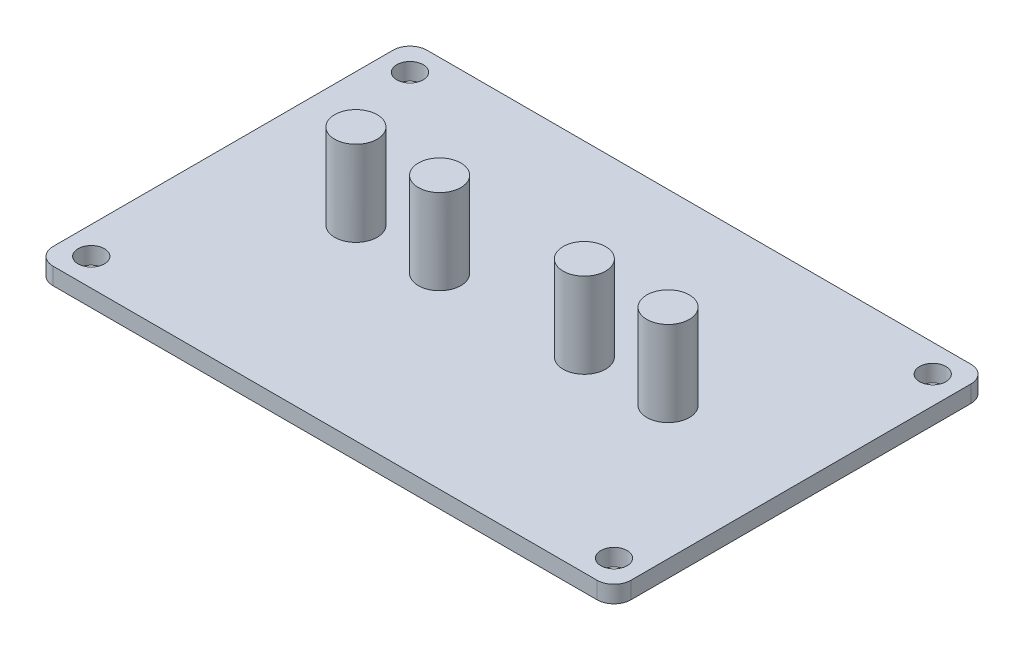
ISO-10303-21;
HEADER;
FILE_DESCRIPTION(('STEP AP214'),'2;1');
FILE_NAME('part.step','',(''),(''),'','','');
FILE_SCHEMA(('AUTOMOTIVE_DESIGN { 1 0 10303 214 1 1 1 1 }'));
ENDSEC;
DATA;
#1=APPLICATION_CONTEXT('core data for automotive mechanical design processes');
#2=APPLICATION_PROTOCOL_DEFINITION('international standard','automotive_design',2000,#1);
#3=PRODUCT_CONTEXT('',#1,'mechanical');
#4=PRODUCT('Part','Part','',(#3));
#5=PRODUCT_RELATED_PRODUCT_CATEGORY('part','',(#4));
#6=PRODUCT_DEFINITION_FORMATION('','',#4);
#7=PRODUCT_DEFINITION_CONTEXT('part definition',#1,'design');
#8=PRODUCT_DEFINITION('design','',#6,#7);
#9=PRODUCT_DEFINITION_SHAPE('','',#8);
#10=(LENGTH_UNIT() NAMED_UNIT(*) SI_UNIT(.MILLI.,.METRE.));
#11=(NAMED_UNIT(*) PLANE_ANGLE_UNIT() SI_UNIT($,.RADIAN.));
#12=(NAMED_UNIT(*) SI_UNIT($,.STERADIAN.) SOLID_ANGLE_UNIT());
#13=UNCERTAINTY_MEASURE_WITH_UNIT(LENGTH_MEASURE(1.E-05),#10,'distance_accuracy_value','');
#14=(GEOMETRIC_REPRESENTATION_CONTEXT(3) GLOBAL_UNCERTAINTY_ASSIGNED_CONTEXT((#13)) GLOBAL_UNIT_ASSIGNED_CONTEXT((#10,
#11,#12)) REPRESENTATION_CONTEXT('',''));
#15=CARTESIAN_POINT('',(0.,0.,0.));
#16=DIRECTION('',(0.,0.,1.));
#17=DIRECTION('',(1.,0.,0.));
#18=AXIS2_PLACEMENT_3D('',#15,#16,#17);
#19=CARTESIAN_POINT('',(34.,2.,22.));
#20=DIRECTION('',(-1.,0.,0.));
#21=DIRECTION('',(0.,0.,1.));
#22=AXIS2_PLACEMENT_3D('',#19,#20,#21);
#23=PLANE('',#22);
#24=DIRECTION('',(0.,0.,-1.));
#25=VECTOR('',#24,1.);
#26=CARTESIAN_POINT('',(34.,0.,22.));
#27=LINE('',#26,#25);
#28=CARTESIAN_POINT('',(34.,0.,20.));
#29=VERTEX_POINT('',#28);
#30=CARTESIAN_POINT('',(34.,0.,-20.));
#31=VERTEX_POINT('',#30);
#32=EDGE_CURVE('E129',#29,#31,#27,.T.);
#33=ORIENTED_EDGE('',*,*,#32,.T.);
#34=DIRECTION('',(0.,-1.,0.));
#35=VECTOR('',#34,1.);
#36=CARTESIAN_POINT('',(34.,2.,-20.));
#37=LINE('',#36,#35);
#38=CARTESIAN_POINT('',(34.,2.,-20.));
#39=VERTEX_POINT('',#38);
#40=EDGE_CURVE('E164',#31,#39,#37,.F.);
#41=ORIENTED_EDGE('',*,*,#40,.T.);
#42=DIRECTION('',(0.,0.,-1.));
#43=VECTOR('',#42,1.);
#44=CARTESIAN_POINT('',(34.,2.,22.));
#45=LINE('',#44,#43);
#46=CARTESIAN_POINT('',(34.,2.,20.));
#47=VERTEX_POINT('',#46);
#48=EDGE_CURVE('E127',#47,#39,#45,.T.);
#49=ORIENTED_EDGE('',*,*,#48,.F.);
#50=DIRECTION('',(0.,-1.,0.));
#51=VECTOR('',#50,1.);
#52=CARTESIAN_POINT('',(34.,2.,20.));
#53=LINE('',#52,#51);
#54=EDGE_CURVE('E161',#47,#29,#53,.T.);
#55=ORIENTED_EDGE('',*,*,#54,.T.);
#56=EDGE_LOOP('',(#33,#41,#49,#55));
#57=FACE_BOUND('',#56,.T.);
#58=ADVANCED_FACE('F34',(#57),#23,.F.);
#59=CARTESIAN_POINT('',(-34.,2.,-22.));
#60=DIRECTION('',(0.,0.,1.));
#61=DIRECTION('',(1.,0.,0.));
#62=AXIS2_PLACEMENT_3D('',#59,#60,#61);
#63=PLANE('',#62);
#64=DIRECTION('',(-1.,0.,0.));
#65=VECTOR('',#64,1.);
#66=CARTESIAN_POINT('',(-34.,0.,-22.));
#67=LINE('',#66,#65);
#68=CARTESIAN_POINT('',(32.,0.,-22.));
#69=VERTEX_POINT('',#68);
#70=CARTESIAN_POINT('',(-32.,0.,-22.));
#71=VERTEX_POINT('',#70);
#72=EDGE_CURVE('E125',#69,#71,#67,.T.);
#73=ORIENTED_EDGE('',*,*,#72,.T.);
#74=DIRECTION('',(0.,-1.,0.));
#75=VECTOR('',#74,1.);
#76=CARTESIAN_POINT('',(-32.,2.,-22.));
#77=LINE('',#76,#75);
#78=CARTESIAN_POINT('',(-32.,2.,-22.));
#79=VERTEX_POINT('',#78);
#80=EDGE_CURVE('E104',#71,#79,#77,.F.);
#81=ORIENTED_EDGE('',*,*,#80,.T.);
#82=DIRECTION('',(-1.,0.,0.));
#83=VECTOR('',#82,1.);
#84=CARTESIAN_POINT('',(-34.,2.,-22.));
#85=LINE('',#84,#83);
#86=CARTESIAN_POINT('',(32.,2.,-22.));
#87=VERTEX_POINT('',#86);
#88=EDGE_CURVE('E180',#87,#79,#85,.T.);
#89=ORIENTED_EDGE('',*,*,#88,.F.);
#90=DIRECTION('',(0.,-1.,0.));
#91=VECTOR('',#90,1.);
#92=CARTESIAN_POINT('',(32.,2.,-22.));
#93=LINE('',#92,#91);
#94=EDGE_CURVE('E109',#87,#69,#93,.T.);
#95=ORIENTED_EDGE('',*,*,#94,.T.);
#96=EDGE_LOOP('',(#73,#81,#89,#95));
#97=FACE_BOUND('',#96,.T.);
#98=ADVANCED_FACE('F255',(#97),#63,.F.);
#99=CARTESIAN_POINT('',(-34.,2.,22.));
#100=DIRECTION('',(1.,0.,0.));
#101=DIRECTION('',(0.,0.,-1.));
#102=AXIS2_PLACEMENT_3D('',#99,#100,#101);
#103=PLANE('',#102);
#104=DIRECTION('',(0.,0.,1.));
#105=VECTOR('',#104,1.);
#106=CARTESIAN_POINT('',(-34.,2.,22.));
#107=LINE('',#106,#105);
#108=CARTESIAN_POINT('',(-34.,2.,-20.));
#109=VERTEX_POINT('',#108);
#110=CARTESIAN_POINT('',(-34.,2.,20.));
#111=VERTEX_POINT('',#110);
#112=EDGE_CURVE('E118',#109,#111,#107,.T.);
#113=ORIENTED_EDGE('',*,*,#112,.F.);
#114=DIRECTION('',(0.,-1.,0.));
#115=VECTOR('',#114,1.);
#116=CARTESIAN_POINT('',(-34.,2.,-20.));
#117=LINE('',#116,#115);
#118=CARTESIAN_POINT('',(-34.,0.,-20.));
#119=VERTEX_POINT('',#118);
#120=EDGE_CURVE('E103',#109,#119,#117,.T.);
#121=ORIENTED_EDGE('',*,*,#120,.T.);
#122=DIRECTION('',(0.,0.,1.));
#123=VECTOR('',#122,1.);
#124=CARTESIAN_POINT('',(-34.,0.,22.));
#125=LINE('',#124,#123);
#126=CARTESIAN_POINT('',(-34.,0.,20.));
#127=VERTEX_POINT('',#126);
#128=EDGE_CURVE('E116',#119,#127,#125,.T.);
#129=ORIENTED_EDGE('',*,*,#128,.T.);
#130=DIRECTION('',(0.,-1.,0.));
#131=VECTOR('',#130,1.);
#132=CARTESIAN_POINT('',(-34.,2.,20.));
#133=LINE('',#132,#131);
#134=EDGE_CURVE('E120',#127,#111,#133,.F.);
#135=ORIENTED_EDGE('',*,*,#134,.T.);
#136=EDGE_LOOP('',(#113,#121,#129,#135));
#137=FACE_BOUND('',#136,.T.);
#138=ADVANCED_FACE('F115',(#137),#103,.F.);
#139=CARTESIAN_POINT('',(-34.,2.,22.));
#140=DIRECTION('',(0.,0.,-1.));
#141=DIRECTION('',(-1.,0.,0.));
#142=AXIS2_PLACEMENT_3D('',#139,#140,#141);
#143=PLANE('',#142);
#144=DIRECTION('',(1.,0.,0.));
#145=VECTOR('',#144,1.);
#146=CARTESIAN_POINT('',(-34.,0.,22.));
#147=LINE('',#146,#145);
#148=CARTESIAN_POINT('',(-32.,0.,22.));
#149=VERTEX_POINT('',#148);
#150=CARTESIAN_POINT('',(32.,0.,22.));
#151=VERTEX_POINT('',#150);
#152=EDGE_CURVE('E124',#149,#151,#147,.T.);
#153=ORIENTED_EDGE('',*,*,#152,.T.);
#154=DIRECTION('',(0.,-1.,0.));
#155=VECTOR('',#154,1.);
#156=CARTESIAN_POINT('',(32.,2.,22.));
#157=LINE('',#156,#155);
#158=CARTESIAN_POINT('',(32.,2.,22.));
#159=VERTEX_POINT('',#158);
#160=EDGE_CURVE('E11',#151,#159,#157,.F.);
#161=ORIENTED_EDGE('',*,*,#160,.T.);
#162=DIRECTION('',(1.,0.,0.));
#163=VECTOR('',#162,1.);
#164=CARTESIAN_POINT('',(-34.,2.,22.));
#165=LINE('',#164,#163);
#166=CARTESIAN_POINT('',(-32.,2.,22.));
#167=VERTEX_POINT('',#166);
#168=EDGE_CURVE('E137',#167,#159,#165,.T.);
#169=ORIENTED_EDGE('',*,*,#168,.F.);
#170=DIRECTION('',(0.,-1.,0.));
#171=VECTOR('',#170,1.);
#172=CARTESIAN_POINT('',(-32.,2.,22.));
#173=LINE('',#172,#171);
#174=EDGE_CURVE('E42',#167,#149,#173,.T.);
#175=ORIENTED_EDGE('',*,*,#174,.T.);
#176=EDGE_LOOP('',(#153,#161,#169,#175));
#177=FACE_BOUND('',#176,.T.);
#178=ADVANCED_FACE('F167',(#177),#143,.F.);
#179=CARTESIAN_POINT('',(0.,2.,0.));
#180=DIRECTION('',(0.,-1.,0.));
#181=DIRECTION('',(0.,0.,-1.));
#182=AXIS2_PLACEMENT_3D('',#179,#180,#181);
#183=PLANE('',#182);
#184=CARTESIAN_POINT('',(30.75,2.,-18.75));
#185=DIRECTION('',(0.,1.,0.));
#186=DIRECTION('',(0.,0.,-1.));
#187=AXIS2_PLACEMENT_3D('',#184,#185,#186);
#188=CIRCLE('',#187,1.54999999999999);
#189=CARTESIAN_POINT('',(30.75,2.,-20.3));
#190=VERTEX_POINT('',#189);
#191=EDGE_CURVE('E210',#190,#190,#188,.T.);
#192=ORIENTED_EDGE('',*,*,#191,.F.);
#193=EDGE_LOOP('',(#192));
#194=FACE_BOUND('',#193,.T.);
#195=CARTESIAN_POINT('',(30.75,2.,18.75));
#196=DIRECTION('',(0.,1.,0.));
#197=DIRECTION('',(0.,0.,1.));
#198=AXIS2_PLACEMENT_3D('',#195,#196,#197);
#199=CIRCLE('',#198,1.54999999999999);
#200=CARTESIAN_POINT('',(30.75,2.,20.3));
#201=VERTEX_POINT('',#200);
#202=EDGE_CURVE('E216',#201,#201,#199,.T.);
#203=ORIENTED_EDGE('',*,*,#202,.F.);
#204=EDGE_LOOP('',(#203));
#205=FACE_BOUND('',#204,.T.);
#206=CARTESIAN_POINT('',(-30.75,2.,18.75));
#207=DIRECTION('',(0.,1.,0.));
#208=DIRECTION('',(0.,0.,-1.));
#209=AXIS2_PLACEMENT_3D('',#206,#207,#208);
#210=CIRCLE('',#209,1.55);
#211=CARTESIAN_POINT('',(-30.75,2.,17.2));
#212=VERTEX_POINT('',#211);
#213=EDGE_CURVE('E222',#212,#212,#210,.T.);
#214=ORIENTED_EDGE('',*,*,#213,.F.);
#215=EDGE_LOOP('',(#214));
#216=FACE_BOUND('',#215,.T.);
#217=CARTESIAN_POINT('',(-30.75,2.,-18.75));
#218=DIRECTION('',(0.,1.,0.));
#219=DIRECTION('',(0.,0.,1.));
#220=AXIS2_PLACEMENT_3D('',#217,#218,#219);
#221=CIRCLE('',#220,1.55);
#222=CARTESIAN_POINT('',(-30.75,2.,-17.2));
#223=VERTEX_POINT('',#222);
#224=EDGE_CURVE('E204',#223,#223,#221,.T.);
#225=ORIENTED_EDGE('',*,*,#224,.F.);
#226=EDGE_LOOP('',(#225));
#227=FACE_BOUND('',#226,.T.);
#228=CARTESIAN_POINT('',(18.3621219310143,2.,0.));
#229=DIRECTION('',(0.,-1.,0.));
#230=DIRECTION('',(0.,0.,-1.));
#231=AXIS2_PLACEMENT_3D('',#228,#229,#230);
#232=CIRCLE('',#231,2.5);
#233=CARTESIAN_POINT('',(18.3621219310143,2.,-2.5));
#234=VERTEX_POINT('',#233);
#235=EDGE_CURVE('E143',#234,#234,#232,.F.);
#236=ORIENTED_EDGE('',*,*,#235,.F.);
#237=EDGE_LOOP('',(#236));
#238=FACE_BOUND('',#237,.T.);
#239=CARTESIAN_POINT('',(8.51424558136531,2.,0.));
#240=DIRECTION('',(0.,-1.,0.));
#241=DIRECTION('',(0.,0.,-1.));
#242=AXIS2_PLACEMENT_3D('',#239,#240,#241);
#243=CIRCLE('',#242,2.5);
#244=CARTESIAN_POINT('',(8.51424558136531,2.,-2.5));
#245=VERTEX_POINT('',#244);
#246=EDGE_CURVE('E140',#245,#245,#243,.F.);
#247=ORIENTED_EDGE('',*,*,#246,.F.);
#248=EDGE_LOOP('',(#247));
#249=FACE_BOUND('',#248,.T.);
#250=CARTESIAN_POINT('',(-8.51424558136531,2.,0.));
#251=DIRECTION('',(0.,-1.,0.));
#252=DIRECTION('',(0.,0.,-1.));
#253=AXIS2_PLACEMENT_3D('',#250,#251,#252);
#254=CIRCLE('',#253,2.5);
#255=CARTESIAN_POINT('',(-8.51424558136531,2.,-2.5));
#256=VERTEX_POINT('',#255);
#257=EDGE_CURVE('E136',#256,#256,#254,.F.);
#258=ORIENTED_EDGE('',*,*,#257,.F.);
#259=EDGE_LOOP('',(#258));
#260=FACE_BOUND('',#259,.T.);
#261=CARTESIAN_POINT('',(-18.3621219310143,2.,0.));
#262=DIRECTION('',(0.,-1.,0.));
#263=DIRECTION('',(0.,0.,-1.));
#264=AXIS2_PLACEMENT_3D('',#261,#262,#263);
#265=CIRCLE('',#264,2.5);
#266=CARTESIAN_POINT('',(-18.3621219310143,2.,-2.5));
#267=VERTEX_POINT('',#266);
#268=EDGE_CURVE('E133',#267,#267,#265,.F.);
#269=ORIENTED_EDGE('',*,*,#268,.F.);
#270=EDGE_LOOP('',(#269));
#271=FACE_BOUND('',#270,.T.);
#272=ORIENTED_EDGE('',*,*,#88,.T.);
#273=CARTESIAN_POINT('',(-32.,2.,-20.));
#274=DIRECTION('',(0.,-1.,0.));
#275=DIRECTION('',(0.,0.,-1.));
#276=AXIS2_PLACEMENT_3D('',#273,#274,#275);
#277=CIRCLE('',#276,2.);
#278=EDGE_CURVE('E159',#79,#109,#277,.F.);
#279=ORIENTED_EDGE('',*,*,#278,.T.);
#280=ORIENTED_EDGE('',*,*,#112,.T.);
#281=CARTESIAN_POINT('',(-32.,2.,20.));
#282=DIRECTION('',(0.,-1.,0.));
#283=DIRECTION('',(0.,0.,-1.));
#284=AXIS2_PLACEMENT_3D('',#281,#282,#283);
#285=CIRCLE('',#284,2.);
#286=EDGE_CURVE('E54',#111,#167,#285,.F.);
#287=ORIENTED_EDGE('',*,*,#286,.T.);
#288=ORIENTED_EDGE('',*,*,#168,.T.);
#289=CARTESIAN_POINT('',(32.,2.,20.));
#290=DIRECTION('',(0.,-1.,0.));
#291=DIRECTION('',(0.,0.,-1.));
#292=AXIS2_PLACEMENT_3D('',#289,#290,#291);
#293=CIRCLE('',#292,2.);
#294=EDGE_CURVE('E155',#159,#47,#293,.F.);
#295=ORIENTED_EDGE('',*,*,#294,.T.);
#296=ORIENTED_EDGE('',*,*,#48,.T.);
#297=CARTESIAN_POINT('',(32.,2.,-20.));
#298=DIRECTION('',(0.,-1.,0.));
#299=DIRECTION('',(0.,0.,-1.));
#300=AXIS2_PLACEMENT_3D('',#297,#298,#299);
#301=CIRCLE('',#300,2.);
#302=EDGE_CURVE('E157',#39,#87,#301,.F.);
#303=ORIENTED_EDGE('',*,*,#302,.T.);
#304=EDGE_LOOP('',(#272,#279,#280,#287,#288,#295,#296,#303));
#305=FACE_BOUND('',#304,.T.);
#306=ADVANCED_FACE('F238',(#194,#205,#216,#227,#238,#249,#260,#271,#305),#183,.F.);
#307=CARTESIAN_POINT('',(0.,0.,0.));
#308=DIRECTION('',(0.,-1.,0.));
#309=DIRECTION('',(0.,0.,-1.));
#310=AXIS2_PLACEMENT_3D('',#307,#308,#309);
#311=PLANE('',#310);
#312=CARTESIAN_POINT('',(30.75,0.,-18.75));
#313=DIRECTION('',(0.,1.,0.));
#314=DIRECTION('',(0.,0.,-1.));
#315=AXIS2_PLACEMENT_3D('',#312,#313,#314);
#316=CIRCLE('',#315,1.54999999999999);
#317=CARTESIAN_POINT('',(30.75,0.,-20.3));
#318=VERTEX_POINT('',#317);
#319=EDGE_CURVE('E213',#318,#318,#316,.T.);
#320=ORIENTED_EDGE('',*,*,#319,.T.);
#321=EDGE_LOOP('',(#320));
#322=FACE_BOUND('',#321,.T.);
#323=CARTESIAN_POINT('',(30.75,0.,18.75));
#324=DIRECTION('',(0.,1.,0.));
#325=DIRECTION('',(0.,0.,1.));
#326=AXIS2_PLACEMENT_3D('',#323,#324,#325);
#327=CIRCLE('',#326,1.54999999999999);
#328=CARTESIAN_POINT('',(30.75,0.,20.3));
#329=VERTEX_POINT('',#328);
#330=EDGE_CURVE('E219',#329,#329,#327,.T.);
#331=ORIENTED_EDGE('',*,*,#330,.T.);
#332=EDGE_LOOP('',(#331));
#333=FACE_BOUND('',#332,.T.);
#334=CARTESIAN_POINT('',(-30.75,0.,18.75));
#335=DIRECTION('',(0.,1.,0.));
#336=DIRECTION('',(0.,0.,-1.));
#337=AXIS2_PLACEMENT_3D('',#334,#335,#336);
#338=CIRCLE('',#337,1.55);
#339=CARTESIAN_POINT('',(-30.75,0.,17.2));
#340=VERTEX_POINT('',#339);
#341=EDGE_CURVE('E207',#340,#340,#338,.T.);
#342=ORIENTED_EDGE('',*,*,#341,.T.);
#343=EDGE_LOOP('',(#342));
#344=FACE_BOUND('',#343,.T.);
#345=CARTESIAN_POINT('',(-30.75,0.,-18.75));
#346=DIRECTION('',(0.,1.,0.));
#347=DIRECTION('',(0.,0.,1.));
#348=AXIS2_PLACEMENT_3D('',#345,#346,#347);
#349=CIRCLE('',#348,1.55);
#350=CARTESIAN_POINT('',(-30.75,0.,-17.2));
#351=VERTEX_POINT('',#350);
#352=EDGE_CURVE('E203',#351,#351,#349,.T.);
#353=ORIENTED_EDGE('',*,*,#352,.T.);
#354=EDGE_LOOP('',(#353));
#355=FACE_BOUND('',#354,.T.);
#356=ORIENTED_EDGE('',*,*,#128,.F.);
#357=CARTESIAN_POINT('',(-32.,0.,-20.));
#358=DIRECTION('',(0.,-1.,0.));
#359=DIRECTION('',(0.,0.,-1.));
#360=AXIS2_PLACEMENT_3D('',#357,#358,#359);
#361=CIRCLE('',#360,2.);
#362=EDGE_CURVE('E99',#119,#71,#361,.T.);
#363=ORIENTED_EDGE('',*,*,#362,.T.);
#364=ORIENTED_EDGE('',*,*,#72,.F.);
#365=CARTESIAN_POINT('',(32.,0.,-20.));
#366=DIRECTION('',(0.,-1.,0.));
#367=DIRECTION('',(0.,0.,-1.));
#368=AXIS2_PLACEMENT_3D('',#365,#366,#367);
#369=CIRCLE('',#368,2.);
#370=EDGE_CURVE('E110',#69,#31,#369,.T.);
#371=ORIENTED_EDGE('',*,*,#370,.T.);
#372=ORIENTED_EDGE('',*,*,#32,.F.);
#373=CARTESIAN_POINT('',(32.,0.,20.));
#374=DIRECTION('',(0.,-1.,0.));
#375=DIRECTION('',(0.,0.,-1.));
#376=AXIS2_PLACEMENT_3D('',#373,#374,#375);
#377=CIRCLE('',#376,2.);
#378=EDGE_CURVE('E148',#29,#151,#377,.T.);
#379=ORIENTED_EDGE('',*,*,#378,.T.);
#380=ORIENTED_EDGE('',*,*,#152,.F.);
#381=CARTESIAN_POINT('',(-32.,0.,20.));
#382=DIRECTION('',(0.,-1.,0.));
#383=DIRECTION('',(0.,0.,-1.));
#384=AXIS2_PLACEMENT_3D('',#381,#382,#383);
#385=CIRCLE('',#384,2.);
#386=EDGE_CURVE('E119',#149,#127,#385,.T.);
#387=ORIENTED_EDGE('',*,*,#386,.T.);
#388=EDGE_LOOP('',(#356,#363,#364,#371,#372,#379,#380,#387));
#389=FACE_BOUND('',#388,.T.);
#390=ADVANCED_FACE('F122',(#322,#333,#344,#355,#389),#311,.T.);
#391=CARTESIAN_POINT('',(-18.3621219310143,12.,0.));
#392=DIRECTION('',(0.,-1.,0.));
#393=DIRECTION('',(0.,0.,-1.));
#394=AXIS2_PLACEMENT_3D('',#391,#392,#393);
#395=CYLINDRICAL_SURFACE('',#394,2.5);
#396=CARTESIAN_POINT('',(-18.3621219310143,12.,0.));
#397=DIRECTION('',(0.,1.,0.));
#398=DIRECTION('',(0.,0.,1.));
#399=AXIS2_PLACEMENT_3D('',#396,#397,#398);
#400=CIRCLE('',#399,2.5);
#401=CARTESIAN_POINT('',(-18.3621219310143,12.,2.5));
#402=VERTEX_POINT('',#401);
#403=EDGE_CURVE('E185',#402,#402,#400,.T.);
#404=ORIENTED_EDGE('',*,*,#403,.F.);
#405=EDGE_LOOP('',(#404));
#406=FACE_BOUND('',#405,.T.);
#407=ORIENTED_EDGE('',*,*,#268,.T.);
#408=EDGE_LOOP('',(#407));
#409=FACE_BOUND('',#408,.T.);
#410=ADVANCED_FACE('F278',(#406,#409),#395,.T.);
#411=CARTESIAN_POINT('',(-18.3621219310143,12.,0.));
#412=DIRECTION('',(0.,1.,0.));
#413=DIRECTION('',(0.,0.,1.));
#414=AXIS2_PLACEMENT_3D('',#411,#412,#413);
#415=PLANE('',#414);
#416=ORIENTED_EDGE('',*,*,#403,.T.);
#417=EDGE_LOOP('',(#416));
#418=FACE_BOUND('',#417,.T.);
#419=ADVANCED_FACE('F283',(#418),#415,.T.);
#420=CARTESIAN_POINT('',(-8.51424558136531,12.,0.));
#421=DIRECTION('',(0.,-1.,0.));
#422=DIRECTION('',(0.,0.,-1.));
#423=AXIS2_PLACEMENT_3D('',#420,#421,#422);
#424=CYLINDRICAL_SURFACE('',#423,2.5);
#425=CARTESIAN_POINT('',(-8.51424558136531,12.,0.));
#426=DIRECTION('',(0.,1.,0.));
#427=DIRECTION('',(0.,0.,1.));
#428=AXIS2_PLACEMENT_3D('',#425,#426,#427);
#429=CIRCLE('',#428,2.5);
#430=CARTESIAN_POINT('',(-8.51424558136531,12.,2.5));
#431=VERTEX_POINT('',#430);
#432=EDGE_CURVE('E190',#431,#431,#429,.T.);
#433=ORIENTED_EDGE('',*,*,#432,.F.);
#434=EDGE_LOOP('',(#433));
#435=FACE_BOUND('',#434,.T.);
#436=ORIENTED_EDGE('',*,*,#257,.T.);
#437=EDGE_LOOP('',(#436));
#438=FACE_BOUND('',#437,.T.);
#439=ADVANCED_FACE('F287',(#435,#438),#424,.T.);
#440=CARTESIAN_POINT('',(-8.51424558136531,12.,0.));
#441=DIRECTION('',(0.,1.,0.));
#442=DIRECTION('',(0.,0.,1.));
#443=AXIS2_PLACEMENT_3D('',#440,#441,#442);
#444=PLANE('',#443);
#445=ORIENTED_EDGE('',*,*,#432,.T.);
#446=EDGE_LOOP('',(#445));
#447=FACE_BOUND('',#446,.T.);
#448=ADVANCED_FACE('F290',(#447),#444,.T.);
#449=CARTESIAN_POINT('',(8.51424558136531,12.,0.));
#450=DIRECTION('',(0.,-1.,0.));
#451=DIRECTION('',(0.,0.,-1.));
#452=AXIS2_PLACEMENT_3D('',#449,#450,#451);
#453=CYLINDRICAL_SURFACE('',#452,2.5);
#454=CARTESIAN_POINT('',(8.51424558136531,12.,0.));
#455=DIRECTION('',(0.,1.,0.));
#456=DIRECTION('',(0.,0.,-1.));
#457=AXIS2_PLACEMENT_3D('',#454,#455,#456);
#458=CIRCLE('',#457,2.5);
#459=CARTESIAN_POINT('',(8.51424558136531,12.,-2.5));
#460=VERTEX_POINT('',#459);
#461=EDGE_CURVE('E194',#460,#460,#458,.T.);
#462=ORIENTED_EDGE('',*,*,#461,.F.);
#463=EDGE_LOOP('',(#462));
#464=FACE_BOUND('',#463,.T.);
#465=ORIENTED_EDGE('',*,*,#246,.T.);
#466=EDGE_LOOP('',(#465));
#467=FACE_BOUND('',#466,.T.);
#468=ADVANCED_FACE('F294',(#464,#467),#453,.T.);
#469=CARTESIAN_POINT('',(8.51424558136531,12.,0.));
#470=DIRECTION('',(0.,-1.,0.));
#471=DIRECTION('',(0.,0.,-1.));
#472=AXIS2_PLACEMENT_3D('',#469,#470,#471);
#473=PLANE('',#472);
#474=ORIENTED_EDGE('',*,*,#461,.T.);
#475=EDGE_LOOP('',(#474));
#476=FACE_BOUND('',#475,.T.);
#477=ADVANCED_FACE('F297',(#476),#473,.F.);
#478=CARTESIAN_POINT('',(18.3621219310143,12.,0.));
#479=DIRECTION('',(0.,-1.,0.));
#480=DIRECTION('',(0.,0.,-1.));
#481=AXIS2_PLACEMENT_3D('',#478,#479,#480);
#482=CYLINDRICAL_SURFACE('',#481,2.5);
#483=CARTESIAN_POINT('',(18.3621219310143,12.,0.));
#484=DIRECTION('',(0.,1.,0.));
#485=DIRECTION('',(0.,0.,-1.));
#486=AXIS2_PLACEMENT_3D('',#483,#484,#485);
#487=CIRCLE('',#486,2.5);
#488=CARTESIAN_POINT('',(18.3621219310143,12.,-2.5));
#489=VERTEX_POINT('',#488);
#490=EDGE_CURVE('E198',#489,#489,#487,.T.);
#491=ORIENTED_EDGE('',*,*,#490,.F.);
#492=EDGE_LOOP('',(#491));
#493=FACE_BOUND('',#492,.T.);
#494=ORIENTED_EDGE('',*,*,#235,.T.);
#495=EDGE_LOOP('',(#494));
#496=FACE_BOUND('',#495,.T.);
#497=ADVANCED_FACE('F301',(#493,#496),#482,.T.);
#498=CARTESIAN_POINT('',(18.3621219310143,12.,0.));
#499=DIRECTION('',(0.,-1.,0.));
#500=DIRECTION('',(0.,0.,-1.));
#501=AXIS2_PLACEMENT_3D('',#498,#499,#500);
#502=PLANE('',#501);
#503=ORIENTED_EDGE('',*,*,#490,.T.);
#504=EDGE_LOOP('',(#503));
#505=FACE_BOUND('',#504,.T.);
#506=ADVANCED_FACE('F305',(#505),#502,.F.);
#507=CARTESIAN_POINT('',(-30.75,0.,-18.75));
#508=DIRECTION('',(0.,1.,0.));
#509=DIRECTION('',(0.,0.,1.));
#510=AXIS2_PLACEMENT_3D('',#507,#508,#509);
#511=CYLINDRICAL_SURFACE('',#510,1.55);
#512=ORIENTED_EDGE('',*,*,#352,.F.);
#513=EDGE_LOOP('',(#512));
#514=FACE_BOUND('',#513,.T.);
#515=ORIENTED_EDGE('',*,*,#224,.T.);
#516=EDGE_LOOP('',(#515));
#517=FACE_BOUND('',#516,.T.);
#518=ADVANCED_FACE('F234',(#514,#517),#511,.F.);
#519=CARTESIAN_POINT('',(-30.75,0.,18.75));
#520=DIRECTION('',(0.,1.,0.));
#521=DIRECTION('',(0.,0.,1.));
#522=AXIS2_PLACEMENT_3D('',#519,#520,#521);
#523=CYLINDRICAL_SURFACE('',#522,1.55);
#524=ORIENTED_EDGE('',*,*,#341,.F.);
#525=EDGE_LOOP('',(#524));
#526=FACE_BOUND('',#525,.T.);
#527=ORIENTED_EDGE('',*,*,#213,.T.);
#528=EDGE_LOOP('',(#527));
#529=FACE_BOUND('',#528,.T.);
#530=ADVANCED_FACE('F230',(#526,#529),#523,.F.);
#531=CARTESIAN_POINT('',(30.75,0.,18.75));
#532=DIRECTION('',(0.,1.,0.));
#533=DIRECTION('',(0.,0.,1.));
#534=AXIS2_PLACEMENT_3D('',#531,#532,#533);
#535=CYLINDRICAL_SURFACE('',#534,1.54999999999999);
#536=ORIENTED_EDGE('',*,*,#330,.F.);
#537=EDGE_LOOP('',(#536));
#538=FACE_BOUND('',#537,.T.);
#539=ORIENTED_EDGE('',*,*,#202,.T.);
#540=EDGE_LOOP('',(#539));
#541=FACE_BOUND('',#540,.T.);
#542=ADVANCED_FACE('F233',(#538,#541),#535,.F.);
#543=CARTESIAN_POINT('',(30.75,0.,-18.75));
#544=DIRECTION('',(0.,1.,0.));
#545=DIRECTION('',(0.,0.,1.));
#546=AXIS2_PLACEMENT_3D('',#543,#544,#545);
#547=CYLINDRICAL_SURFACE('',#546,1.54999999999999);
#548=ORIENTED_EDGE('',*,*,#319,.F.);
#549=EDGE_LOOP('',(#548));
#550=FACE_BOUND('',#549,.T.);
#551=ORIENTED_EDGE('',*,*,#191,.T.);
#552=EDGE_LOOP('',(#551));
#553=FACE_BOUND('',#552,.T.);
#554=ADVANCED_FACE('F264',(#550,#553),#547,.F.);
#555=CARTESIAN_POINT('',(-32.,2.,-20.));
#556=DIRECTION('',(0.,-1.,0.));
#557=DIRECTION('',(0.,0.,-1.));
#558=AXIS2_PLACEMENT_3D('',#555,#556,#557);
#559=CYLINDRICAL_SURFACE('',#558,2.);
#560=ORIENTED_EDGE('',*,*,#278,.F.);
#561=ORIENTED_EDGE('',*,*,#80,.F.);
#562=ORIENTED_EDGE('',*,*,#362,.F.);
#563=ORIENTED_EDGE('',*,*,#120,.F.);
#564=EDGE_LOOP('',(#560,#561,#562,#563));
#565=FACE_BOUND('',#564,.T.);
#566=ADVANCED_FACE('F102',(#565),#559,.T.);
#567=CARTESIAN_POINT('',(32.,2.,-20.));
#568=DIRECTION('',(0.,-1.,0.));
#569=DIRECTION('',(0.,0.,-1.));
#570=AXIS2_PLACEMENT_3D('',#567,#568,#569);
#571=CYLINDRICAL_SURFACE('',#570,2.);
#572=ORIENTED_EDGE('',*,*,#302,.F.);
#573=ORIENTED_EDGE('',*,*,#40,.F.);
#574=ORIENTED_EDGE('',*,*,#370,.F.);
#575=ORIENTED_EDGE('',*,*,#94,.F.);
#576=EDGE_LOOP('',(#572,#573,#574,#575));
#577=FACE_BOUND('',#576,.T.);
#578=ADVANCED_FACE('F257',(#577),#571,.T.);
#579=CARTESIAN_POINT('',(32.,2.,20.));
#580=DIRECTION('',(0.,-1.,0.));
#581=DIRECTION('',(0.,0.,-1.));
#582=AXIS2_PLACEMENT_3D('',#579,#580,#581);
#583=CYLINDRICAL_SURFACE('',#582,2.);
#584=ORIENTED_EDGE('',*,*,#294,.F.);
#585=ORIENTED_EDGE('',*,*,#160,.F.);
#586=ORIENTED_EDGE('',*,*,#378,.F.);
#587=ORIENTED_EDGE('',*,*,#54,.F.);
#588=EDGE_LOOP('',(#584,#585,#586,#587));
#589=FACE_BOUND('',#588,.T.);
#590=ADVANCED_FACE('F174',(#589),#583,.T.);
#591=CARTESIAN_POINT('',(-32.,2.,20.));
#592=DIRECTION('',(0.,-1.,0.));
#593=DIRECTION('',(0.,0.,-1.));
#594=AXIS2_PLACEMENT_3D('',#591,#592,#593);
#595=CYLINDRICAL_SURFACE('',#594,2.);
#596=ORIENTED_EDGE('',*,*,#286,.F.);
#597=ORIENTED_EDGE('',*,*,#134,.F.);
#598=ORIENTED_EDGE('',*,*,#386,.F.);
#599=ORIENTED_EDGE('',*,*,#174,.F.);
#600=EDGE_LOOP('',(#596,#597,#598,#599));
#601=FACE_BOUND('',#600,.T.);
#602=ADVANCED_FACE('F36',(#601),#595,.T.);
#603=CLOSED_SHELL('',(#58,#98,#138,#178,#306,#390,#410,#419,#439,#448,#468,#477,#497,#506,#518,
#530,#542,#554,#566,#578,#590,#602));
#604=MANIFOLD_SOLID_BREP('B2',#603);
#605=ADVANCED_BREP_SHAPE_REPRESENTATION('',(#18,#604),#14);
#606=SHAPE_DEFINITION_REPRESENTATION(#9,#605);
ENDSEC;
END-ISO-10303-21;
